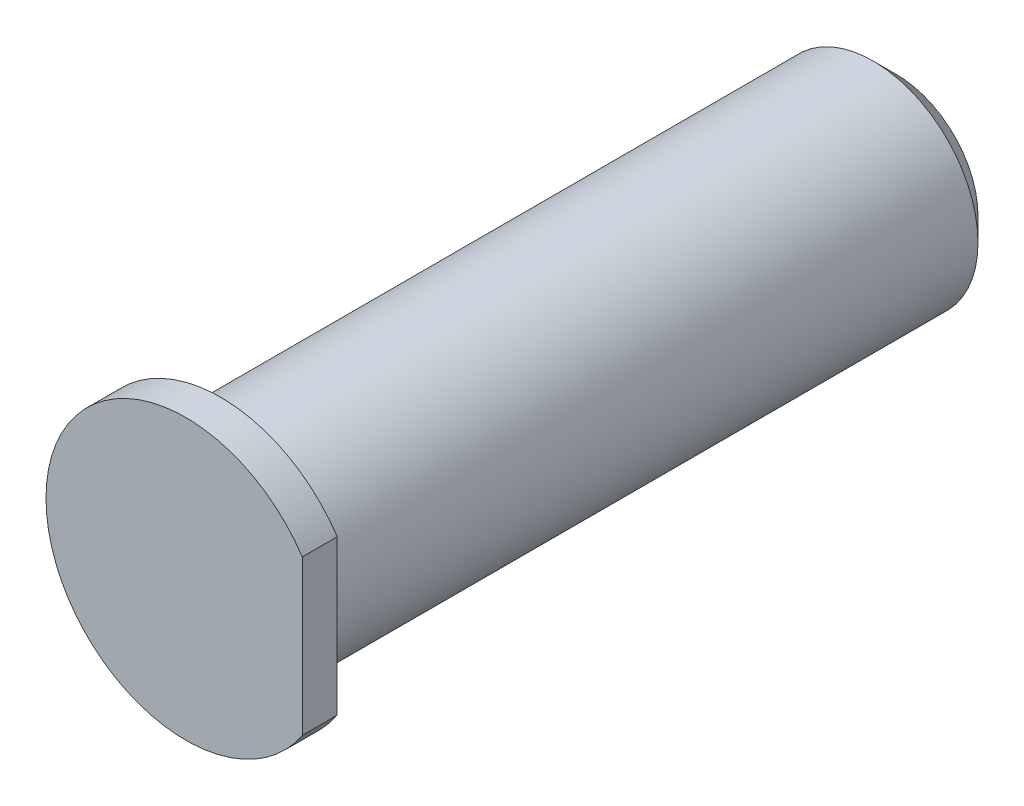
ISO-10303-21;
HEADER;
FILE_DESCRIPTION(('STEP AP214'),'2;1');
FILE_NAME('part.step','',(''),(''),'','','');
FILE_SCHEMA(('AUTOMOTIVE_DESIGN { 1 0 10303 214 1 1 1 1 }'));
ENDSEC;
DATA;
#1=APPLICATION_CONTEXT('core data for automotive mechanical design processes');
#2=APPLICATION_PROTOCOL_DEFINITION('international standard','automotive_design',2000,#1);
#3=PRODUCT_CONTEXT('',#1,'mechanical');
#4=PRODUCT('Part','Part','',(#3));
#5=PRODUCT_RELATED_PRODUCT_CATEGORY('part','',(#4));
#6=PRODUCT_DEFINITION_FORMATION('','',#4);
#7=PRODUCT_DEFINITION_CONTEXT('part definition',#1,'design');
#8=PRODUCT_DEFINITION('design','',#6,#7);
#9=PRODUCT_DEFINITION_SHAPE('','',#8);
#10=(LENGTH_UNIT() NAMED_UNIT(*) SI_UNIT(.MILLI.,.METRE.));
#11=(NAMED_UNIT(*) PLANE_ANGLE_UNIT() SI_UNIT($,.RADIAN.));
#12=(NAMED_UNIT(*) SI_UNIT($,.STERADIAN.) SOLID_ANGLE_UNIT());
#13=UNCERTAINTY_MEASURE_WITH_UNIT(LENGTH_MEASURE(1.E-05),#10,'distance_accuracy_value','');
#14=(GEOMETRIC_REPRESENTATION_CONTEXT(3) GLOBAL_UNCERTAINTY_ASSIGNED_CONTEXT((#13)) GLOBAL_UNIT_ASSIGNED_CONTEXT((#10,
#11,#12)) REPRESENTATION_CONTEXT('',''));
#15=CARTESIAN_POINT('',(0.,0.,0.));
#16=DIRECTION('',(0.,0.,1.));
#17=DIRECTION('',(1.,0.,0.));
#18=AXIS2_PLACEMENT_3D('',#15,#16,#17);
#19=CARTESIAN_POINT('',(0.,0.,-29.));
#20=DIRECTION('',(0.,0.,1.));
#21=DIRECTION('',(1.,0.,0.));
#22=AXIS2_PLACEMENT_3D('',#19,#20,#21);
#23=CYLINDRICAL_SURFACE('',#22,4.5);
#24=CARTESIAN_POINT('',(0.,0.,-28.));
#25=DIRECTION('',(0.,0.,1.));
#26=DIRECTION('',(1.,0.,0.));
#27=AXIS2_PLACEMENT_3D('',#24,#25,#26);
#28=CIRCLE('',#27,4.5);
#29=CARTESIAN_POINT('',(4.5,0.,-28.));
#30=VERTEX_POINT('',#29);
#31=EDGE_CURVE('E38',#30,#30,#28,.T.);
#32=CARTESIAN_POINT('',(0.,0.,0.));
#33=DIRECTION('',(0.,0.,1.));
#34=DIRECTION('',(1.,0.,0.));
#35=AXIS2_PLACEMENT_3D('',#32,#33,#34);
#36=CIRCLE('',#35,4.5);
#37=CARTESIAN_POINT('',(4.5,0.,0.));
#38=VERTEX_POINT('',#37);
#39=EDGE_CURVE('E64',#38,#38,#36,.T.);
#40=CARTESIAN_POINT('',(4.5,0.,-28.));
#41=CARTESIAN_POINT('',(4.5,0.,-27.7083333333333));
#42=CARTESIAN_POINT('',(4.5,0.,-27.4166666666667));
#43=CARTESIAN_POINT('',(4.5,0.,-26.8333333333333));
#44=CARTESIAN_POINT('',(4.5,0.,-26.5416666666667));
#45=CARTESIAN_POINT('',(4.5,0.,-25.9583333333333));
#46=CARTESIAN_POINT('',(4.5,0.,-25.6666666666667));
#47=CARTESIAN_POINT('',(4.5,0.,-25.0833333333333));
#48=CARTESIAN_POINT('',(4.5,0.,-24.7916666666667));
#49=CARTESIAN_POINT('',(4.5,0.,-24.2083333333333));
#50=CARTESIAN_POINT('',(4.5,0.,-23.9166666666667));
#51=CARTESIAN_POINT('',(4.5,0.,-23.3333333333333));
#52=CARTESIAN_POINT('',(4.5,0.,-23.0416666666667));
#53=CARTESIAN_POINT('',(4.5,0.,-22.4583333333333));
#54=CARTESIAN_POINT('',(4.5,0.,-22.1666666666667));
#55=CARTESIAN_POINT('',(4.5,0.,-21.5833333333333));
#56=CARTESIAN_POINT('',(4.5,0.,-21.2916666666667));
#57=CARTESIAN_POINT('',(4.5,0.,-20.7083333333333));
#58=CARTESIAN_POINT('',(4.5,0.,-20.4166666666667));
#59=CARTESIAN_POINT('',(4.5,0.,-19.8333333333333));
#60=CARTESIAN_POINT('',(4.5,0.,-19.5416666666667));
#61=CARTESIAN_POINT('',(4.5,0.,-18.9583333333333));
#62=CARTESIAN_POINT('',(4.5,0.,-18.6666666666667));
#63=CARTESIAN_POINT('',(4.5,0.,-18.0833333333333));
#64=CARTESIAN_POINT('',(4.5,0.,-17.7916666666667));
#65=CARTESIAN_POINT('',(4.5,0.,-17.2083333333333));
#66=CARTESIAN_POINT('',(4.5,0.,-16.9166666666667));
#67=CARTESIAN_POINT('',(4.5,0.,-16.3333333333333));
#68=CARTESIAN_POINT('',(4.5,0.,-16.0416666666667));
#69=CARTESIAN_POINT('',(4.5,0.,-15.4583333333333));
#70=CARTESIAN_POINT('',(4.5,0.,-15.1666666666667));
#71=CARTESIAN_POINT('',(4.5,0.,-14.5833333333333));
#72=CARTESIAN_POINT('',(4.5,0.,-14.2916666666667));
#73=CARTESIAN_POINT('',(4.5,0.,-13.7083333333333));
#74=CARTESIAN_POINT('',(4.5,0.,-13.4166666666667));
#75=CARTESIAN_POINT('',(4.5,0.,-12.8333333333333));
#76=CARTESIAN_POINT('',(4.5,0.,-12.5416666666667));
#77=CARTESIAN_POINT('',(4.5,0.,-11.9583333333333));
#78=CARTESIAN_POINT('',(4.5,0.,-11.6666666666667));
#79=CARTESIAN_POINT('',(4.5,0.,-11.0833333333333));
#80=CARTESIAN_POINT('',(4.5,0.,-10.7916666666667));
#81=CARTESIAN_POINT('',(4.5,0.,-10.2083333333333));
#82=CARTESIAN_POINT('',(4.5,0.,-9.91666666666666));
#83=CARTESIAN_POINT('',(4.5,0.,-9.33333333333333));
#84=CARTESIAN_POINT('',(4.5,0.,-9.04166666666666));
#85=CARTESIAN_POINT('',(4.5,0.,-8.45833333333333));
#86=CARTESIAN_POINT('',(4.5,0.,-8.16666666666666));
#87=CARTESIAN_POINT('',(4.5,0.,-7.58333333333333));
#88=CARTESIAN_POINT('',(4.5,0.,-7.29166666666666));
#89=CARTESIAN_POINT('',(4.5,0.,-6.70833333333333));
#90=CARTESIAN_POINT('',(4.5,0.,-6.41666666666667));
#91=CARTESIAN_POINT('',(4.5,0.,-5.83333333333333));
#92=CARTESIAN_POINT('',(4.5,0.,-5.54166666666666));
#93=CARTESIAN_POINT('',(4.5,0.,-4.95833333333333));
#94=CARTESIAN_POINT('',(4.5,0.,-4.66666666666666));
#95=CARTESIAN_POINT('',(4.5,0.,-4.08333333333333));
#96=CARTESIAN_POINT('',(4.5,0.,-3.79166666666666));
#97=CARTESIAN_POINT('',(4.5,0.,-3.20833333333333));
#98=CARTESIAN_POINT('',(4.5,0.,-2.91666666666666));
#99=CARTESIAN_POINT('',(4.5,0.,-2.33333333333333));
#100=CARTESIAN_POINT('',(4.5,0.,-2.04166666666666));
#101=CARTESIAN_POINT('',(4.5,0.,-1.45833333333333));
#102=CARTESIAN_POINT('',(4.5,0.,-1.16666666666667));
#103=CARTESIAN_POINT('',(4.5,0.,-0.583333333333334));
#104=CARTESIAN_POINT('',(4.5,0.,-0.291666666666667));
#105=CARTESIAN_POINT('',(4.5,0.,0.));
#106=B_SPLINE_CURVE_WITH_KNOTS('',3,(#40,#41,#42,#43,#44,#45,#46,#47,#48,#49,#50,#51,#52,#53,
#54,#55,#56,#57,#58,#59,#60,#61,#62,#63,#64,#65,#66,#67,#68,#69,#70,#71,#72,#73,#74,#75,#76,#77,
#78,#79,#80,#81,#82,#83,#84,#85,#86,#87,#88,#89,#90,#91,#92,#93,#94,#95,#96,#97,#98,#99,#100,
#101,#102,#103,#104,#105),.UNSPECIFIED.,.F.,.F.,(4,2,2,2,2,2,2,2,2,2,2,2,2,2,2,2,2,2,2,2,2,2,2,
2,2,2,2,2,2,2,2,2,4),(0.,0.875000000000001,1.75,2.625,3.5,4.375,5.25,6.125,7.,7.875,8.75,9.625,
10.5,11.375,12.25,13.125,14.,14.875,15.75,16.625,17.5,18.375,19.25,20.125,21.,21.875,22.75,
23.625,24.5,25.375,26.25,27.125,28.),.UNSPECIFIED.);
#107=EDGE_CURVE('BSEAM31',#30,#38,#106,.T.);
#108=ORIENTED_EDGE('',*,*,#31,.T.);
#109=ORIENTED_EDGE('',*,*,#39,.F.);
#110=ORIENTED_EDGE('',*,*,#107,.T.);
#111=ORIENTED_EDGE('',*,*,#107,.F.);
#112=EDGE_LOOP('',(#108,#110,#109,#111));
#113=FACE_BOUND('',#112,.T.);
#114=ADVANCED_FACE('F31',(#113),#23,.T.);
#115=CARTESIAN_POINT('',(0.,0.,-29.));
#116=DIRECTION('',(0.,0.,1.));
#117=DIRECTION('',(1.,0.,0.));
#118=AXIS2_PLACEMENT_3D('',#115,#116,#117);
#119=PLANE('',#118);
#120=CARTESIAN_POINT('',(0.,0.,-29.));
#121=DIRECTION('',(0.,0.,1.));
#122=DIRECTION('',(1.,0.,0.));
#123=AXIS2_PLACEMENT_3D('',#120,#121,#122);
#124=CIRCLE('',#123,3.49999999999999);
#125=CARTESIAN_POINT('',(3.49999999999999,0.,-29.));
#126=VERTEX_POINT('',#125);
#127=EDGE_CURVE('E11',#126,#126,#124,.F.);
#128=ORIENTED_EDGE('',*,*,#127,.T.);
#129=EDGE_LOOP('',(#128));
#130=FACE_BOUND('',#129,.T.);
#131=CARTESIAN_POINT('',(0.,0.,-29.));
#132=DIRECTION('',(0.,0.,-1.));
#133=DIRECTION('',(-1.,0.,0.));
#134=AXIS2_PLACEMENT_3D('',#131,#132,#133);
#135=CIRCLE('',#134,2.);
#136=CARTESIAN_POINT('',(-2.,0.,-29.));
#137=VERTEX_POINT('',#136);
#138=EDGE_CURVE('E126',#137,#137,#135,.T.);
#139=ORIENTED_EDGE('',*,*,#138,.F.);
#140=EDGE_LOOP('',(#139));
#141=FACE_BOUND('',#140,.T.);
#142=ADVANCED_FACE('F99',(#130,#141),#119,.F.);
#143=CARTESIAN_POINT('',(0.,0.,0.));
#144=DIRECTION('',(0.,0.,1.));
#145=DIRECTION('',(1.,0.,0.));
#146=AXIS2_PLACEMENT_3D('',#143,#144,#145);
#147=PLANE('',#146);
#148=CARTESIAN_POINT('',(0.,0.,0.));
#149=DIRECTION('',(0.,0.,1.));
#150=DIRECTION('',(1.,0.,0.));
#151=AXIS2_PLACEMENT_3D('',#148,#149,#150);
#152=CIRCLE('',#151,6.);
#153=CARTESIAN_POINT('',(5.,3.3166247903554,0.));
#154=VERTEX_POINT('',#153);
#155=CARTESIAN_POINT('',(5.,-3.3166247903554,0.));
#156=VERTEX_POINT('',#155);
#157=EDGE_CURVE('E67',#154,#156,#152,.T.);
#158=ORIENTED_EDGE('',*,*,#157,.F.);
#159=DIRECTION('',(0.,-1.,0.));
#160=VECTOR('',#159,1.);
#161=CARTESIAN_POINT('',(5.,3.3166247903554,0.));
#162=LINE('',#161,#160);
#163=EDGE_CURVE('E61',#154,#156,#162,.T.);
#164=ORIENTED_EDGE('',*,*,#163,.T.);
#165=EDGE_LOOP('',(#158,#164));
#166=FACE_BOUND('',#165,.T.);
#167=ORIENTED_EDGE('',*,*,#39,.T.);
#168=EDGE_LOOP('',(#167));
#169=FACE_BOUND('',#168,.T.);
#170=ADVANCED_FACE('F72',(#166,#169),#147,.F.);
#171=CARTESIAN_POINT('',(0.,0.,1.5));
#172=DIRECTION('',(0.,0.,-1.));
#173=DIRECTION('',(-1.,0.,0.));
#174=AXIS2_PLACEMENT_3D('',#171,#172,#173);
#175=CYLINDRICAL_SURFACE('',#174,6.);
#176=ORIENTED_EDGE('',*,*,#157,.T.);
#177=DIRECTION('',(0.,0.,-1.));
#178=VECTOR('',#177,1.);
#179=CARTESIAN_POINT('',(5.,-3.3166247903554,1.5));
#180=LINE('',#179,#178);
#181=CARTESIAN_POINT('',(5.,-3.3166247903554,1.5));
#182=VERTEX_POINT('',#181);
#183=EDGE_CURVE('E57',#182,#156,#180,.T.);
#184=ORIENTED_EDGE('',*,*,#183,.F.);
#185=CARTESIAN_POINT('',(0.,0.,1.5));
#186=DIRECTION('',(0.,0.,1.));
#187=DIRECTION('',(1.,0.,0.));
#188=AXIS2_PLACEMENT_3D('',#185,#186,#187);
#189=CIRCLE('',#188,6.);
#190=CARTESIAN_POINT('',(5.,3.3166247903554,1.5));
#191=VERTEX_POINT('',#190);
#192=EDGE_CURVE('E51',#191,#182,#189,.T.);
#193=ORIENTED_EDGE('',*,*,#192,.F.);
#194=DIRECTION('',(0.,0.,-1.));
#195=VECTOR('',#194,1.);
#196=CARTESIAN_POINT('',(5.,3.3166247903554,1.5));
#197=LINE('',#196,#195);
#198=EDGE_CURVE('E45',#191,#154,#197,.T.);
#199=ORIENTED_EDGE('',*,*,#198,.T.);
#200=EDGE_LOOP('',(#176,#184,#193,#199));
#201=FACE_BOUND('',#200,.T.);
#202=ADVANCED_FACE('F68',(#201),#175,.T.);
#203=CARTESIAN_POINT('',(5.,3.3166247903554,1.5));
#204=DIRECTION('',(1.,0.,0.));
#205=DIRECTION('',(0.,0.,-1.));
#206=AXIS2_PLACEMENT_3D('',#203,#204,#205);
#207=PLANE('',#206);
#208=ORIENTED_EDGE('',*,*,#163,.F.);
#209=ORIENTED_EDGE('',*,*,#198,.F.);
#210=DIRECTION('',(0.,-1.,0.));
#211=VECTOR('',#210,1.);
#212=CARTESIAN_POINT('',(5.,3.3166247903554,1.5));
#213=LINE('',#212,#211);
#214=EDGE_CURVE('E62',#191,#182,#213,.T.);
#215=ORIENTED_EDGE('',*,*,#214,.T.);
#216=ORIENTED_EDGE('',*,*,#183,.T.);
#217=EDGE_LOOP('',(#208,#209,#215,#216));
#218=FACE_BOUND('',#217,.T.);
#219=ADVANCED_FACE('F59',(#218),#207,.T.);
#220=CARTESIAN_POINT('',(0.,0.,1.5));
#221=DIRECTION('',(0.,0.,1.));
#222=DIRECTION('',(1.,0.,0.));
#223=AXIS2_PLACEMENT_3D('',#220,#221,#222);
#224=PLANE('',#223);
#225=ORIENTED_EDGE('',*,*,#192,.T.);
#226=ORIENTED_EDGE('',*,*,#214,.F.);
#227=EDGE_LOOP('',(#225,#226));
#228=FACE_BOUND('',#227,.T.);
#229=ADVANCED_FACE('F114',(#228),#224,.T.);
#230=CARTESIAN_POINT('',(0.,0.,-25.5));
#231=DIRECTION('',(0.,0.,-1.));
#232=DIRECTION('',(-1.,0.,0.));
#233=AXIS2_PLACEMENT_3D('',#230,#231,#232);
#234=CYLINDRICAL_SURFACE('',#233,2.);
#235=CARTESIAN_POINT('',(0.,0.,-25.5));
#236=DIRECTION('',(0.,0.,-1.));
#237=DIRECTION('',(-1.,0.,0.));
#238=AXIS2_PLACEMENT_3D('',#235,#236,#237);
#239=CIRCLE('',#238,2.);
#240=CARTESIAN_POINT('',(-2.,0.,-25.5));
#241=VERTEX_POINT('',#240);
#242=EDGE_CURVE('E70',#241,#241,#239,.T.);
#243=ORIENTED_EDGE('',*,*,#242,.F.);
#244=EDGE_LOOP('',(#243));
#245=FACE_BOUND('',#244,.T.);
#246=ORIENTED_EDGE('',*,*,#138,.T.);
#247=EDGE_LOOP('',(#246));
#248=FACE_BOUND('',#247,.T.);
#249=ADVANCED_FACE('F94',(#245,#248),#234,.F.);
#250=CARTESIAN_POINT('',(0.,0.,-25.5));
#251=DIRECTION('',(0.,0.,-1.));
#252=DIRECTION('',(-1.,0.,0.));
#253=AXIS2_PLACEMENT_3D('',#250,#251,#252);
#254=PLANE('',#253);
#255=ORIENTED_EDGE('',*,*,#242,.T.);
#256=EDGE_LOOP('',(#255));
#257=FACE_BOUND('',#256,.T.);
#258=ADVANCED_FACE('F88',(#257),#254,.T.);
#259=CARTESIAN_POINT('',(0.,0.,-28.));
#260=DIRECTION('',(0.,0.,1.));
#261=DIRECTION('',(1.,0.,0.));
#262=AXIS2_PLACEMENT_3D('',#259,#260,#261);
#263=CONICAL_SURFACE('',#262,4.5,0.785398163397443);
#264=ORIENTED_EDGE('',*,*,#127,.F.);
#265=EDGE_LOOP('',(#264));
#266=FACE_BOUND('',#265,.T.);
#267=ORIENTED_EDGE('',*,*,#31,.F.);
#268=EDGE_LOOP('',(#267));
#269=FACE_BOUND('',#268,.T.);
#270=ADVANCED_FACE('F86',(#266,#269),#263,.T.);
#271=CLOSED_SHELL('',(#114,#142,#170,#202,#219,#229,#249,#258,#270));
#272=MANIFOLD_SOLID_BREP('B2',#271);
#273=ADVANCED_BREP_SHAPE_REPRESENTATION('',(#18,#272),#14);
#274=SHAPE_DEFINITION_REPRESENTATION(#9,#273);
ENDSEC;
END-ISO-10303-21;
